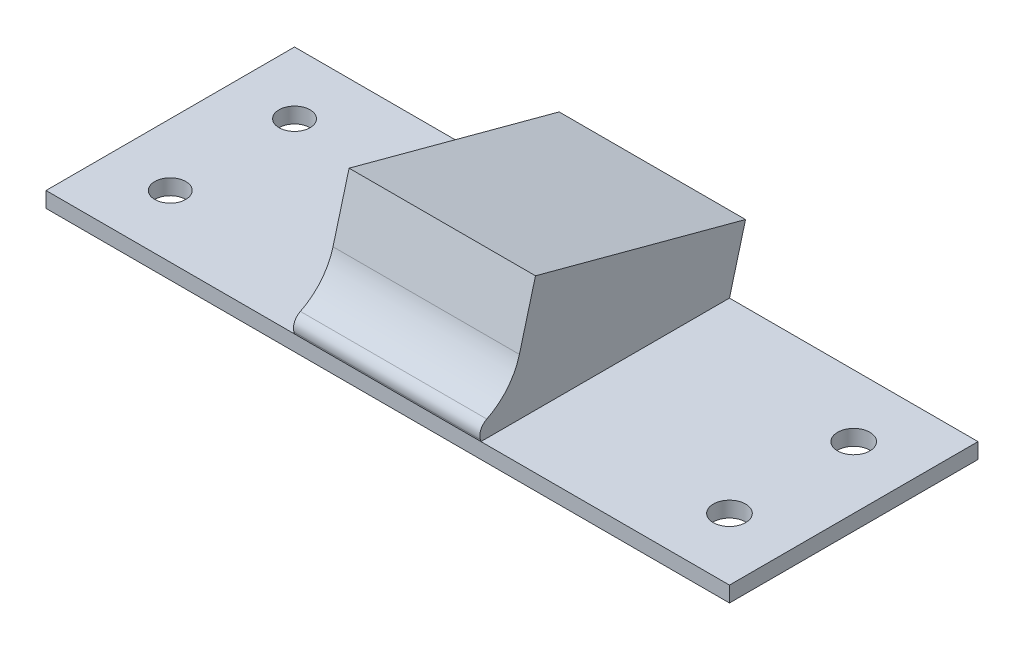
ISO-10303-21;
HEADER;
FILE_DESCRIPTION(('STEP AP214'),'2;1');
FILE_NAME('part.step','',(''),(''),'','','');
FILE_SCHEMA(('AUTOMOTIVE_DESIGN { 1 0 10303 214 1 1 1 1 }'));
ENDSEC;
DATA;
#1=APPLICATION_CONTEXT('core data for automotive mechanical design processes');
#2=APPLICATION_PROTOCOL_DEFINITION('international standard','automotive_design',2000,#1);
#3=PRODUCT_CONTEXT('',#1,'mechanical');
#4=PRODUCT('Part','Part','',(#3));
#5=PRODUCT_RELATED_PRODUCT_CATEGORY('part','',(#4));
#6=PRODUCT_DEFINITION_FORMATION('','',#4);
#7=PRODUCT_DEFINITION_CONTEXT('part definition',#1,'design');
#8=PRODUCT_DEFINITION('design','',#6,#7);
#9=PRODUCT_DEFINITION_SHAPE('','',#8);
#10=(LENGTH_UNIT() NAMED_UNIT(*) SI_UNIT(.MILLI.,.METRE.));
#11=(NAMED_UNIT(*) PLANE_ANGLE_UNIT() SI_UNIT($,.RADIAN.));
#12=(NAMED_UNIT(*) SI_UNIT($,.STERADIAN.) SOLID_ANGLE_UNIT());
#13=UNCERTAINTY_MEASURE_WITH_UNIT(LENGTH_MEASURE(1.E-05),#10,'distance_accuracy_value','');
#14=(GEOMETRIC_REPRESENTATION_CONTEXT(3) GLOBAL_UNCERTAINTY_ASSIGNED_CONTEXT((#13)) GLOBAL_UNIT_ASSIGNED_CONTEXT((#10,
#11,#12)) REPRESENTATION_CONTEXT('',''));
#15=CARTESIAN_POINT('',(0.,0.,0.));
#16=DIRECTION('',(0.,0.,1.));
#17=DIRECTION('',(1.,0.,0.));
#18=AXIS2_PLACEMENT_3D('',#15,#16,#17);
#19=CARTESIAN_POINT('',(88.9,-7.39575421380455,23.1986695137899));
#20=DIRECTION('',(0.,0.28527897121386,-0.958444525563771));
#21=DIRECTION('',(0.,0.958444525563771,0.28527897121386));
#22=AXIS2_PLACEMENT_3D('',#19,#20,#21);
#23=PLANE('',#22);
#24=DIRECTION('',(0.,-0.958444525563771,-0.28527897121386));
#25=VECTOR('',#24,1.);
#26=CARTESIAN_POINT('',(63.5,7.39575421380454,27.6013304862101));
#27=LINE('',#26,#25);
#28=CARTESIAN_POINT('',(63.5,-7.00664085970769,23.31448827469));
#29=VERTEX_POINT('',#28);
#30=CARTESIAN_POINT('',(63.5,-7.39575421380454,23.1986695137899));
#31=VERTEX_POINT('',#30);
#32=EDGE_CURVE('E175',#29,#31,#27,.T.);
#33=ORIENTED_EDGE('',*,*,#32,.F.);
#34=DIRECTION('',(1.,0.,0.));
#35=VECTOR('',#34,1.);
#36=CARTESIAN_POINT('',(88.9,-7.00664085970769,23.31448827469));
#37=LINE('',#36,#35);
#38=CARTESIAN_POINT('',(25.4,-7.00664085970769,23.31448827469));
#39=VERTEX_POINT('',#38);
#40=EDGE_CURVE('E60',#29,#39,#37,.F.);
#41=ORIENTED_EDGE('',*,*,#40,.T.);
#42=DIRECTION('',(0.,0.958444525563771,0.28527897121386));
#43=VECTOR('',#42,1.);
#44=CARTESIAN_POINT('',(25.4,-7.39575421380455,23.1986695137899));
#45=LINE('',#44,#43);
#46=CARTESIAN_POINT('',(25.4,-7.39575421380455,23.1986695137899));
#47=VERTEX_POINT('',#46);
#48=EDGE_CURVE('E173',#47,#39,#45,.T.);
#49=ORIENTED_EDGE('',*,*,#48,.F.);
#50=DIRECTION('',(-1.,0.,0.));
#51=VECTOR('',#50,1.);
#52=CARTESIAN_POINT('',(88.9,-7.39575421380455,23.1986695137899));
#53=LINE('',#52,#51);
#54=EDGE_CURVE('E237',#31,#47,#53,.T.);
#55=ORIENTED_EDGE('',*,*,#54,.F.);
#56=EDGE_LOOP('',(#33,#41,#49,#55));
#57=FACE_BOUND('',#56,.T.);
#58=ADVANCED_FACE('F37',(#57),#23,.F.);
#59=CARTESIAN_POINT('',(88.9,-10.5707542138046,23.1986695137899));
#60=DIRECTION('',(0.,0.,-1.));
#61=DIRECTION('',(0.,1.,0.));
#62=AXIS2_PLACEMENT_3D('',#59,#60,#61);
#63=PLANE('',#62);
#64=CARTESIAN_POINT('',(114.3,-7.39575421380454,23.1986695137899));
#65=VERTEX_POINT('',#64);
#66=EDGE_CURVE('E238',#65,#31,#53,.T.);
#67=ORIENTED_EDGE('',*,*,#66,.T.);
#68=ORIENTED_EDGE('',*,*,#54,.T.);
#69=DIRECTION('',(1.,0.,0.));
#70=VECTOR('',#69,1.);
#71=CARTESIAN_POINT('',(-25.4,-7.39575421380455,23.1986695137899));
#72=LINE('',#71,#70);
#73=CARTESIAN_POINT('',(-25.4,-7.39575421380455,23.1986695137899));
#74=VERTEX_POINT('',#73);
#75=EDGE_CURVE('E228',#74,#47,#72,.T.);
#76=ORIENTED_EDGE('',*,*,#75,.F.);
#77=DIRECTION('',(0.,1.,0.));
#78=VECTOR('',#77,1.);
#79=CARTESIAN_POINT('',(-25.4,-10.5707542138045,23.1986695137899));
#80=LINE('',#79,#78);
#81=CARTESIAN_POINT('',(-25.4,-10.5707542138045,23.1986695137899));
#82=VERTEX_POINT('',#81);
#83=EDGE_CURVE('E222',#82,#74,#80,.T.);
#84=ORIENTED_EDGE('',*,*,#83,.F.);
#85=DIRECTION('',(-1.,0.,0.));
#86=VECTOR('',#85,1.);
#87=CARTESIAN_POINT('',(88.9,-10.5707542138046,23.1986695137899));
#88=LINE('',#87,#86);
#89=CARTESIAN_POINT('',(114.3,-10.5707542138046,23.1986695137899));
#90=VERTEX_POINT('',#89);
#91=EDGE_CURVE('E230',#90,#82,#88,.T.);
#92=ORIENTED_EDGE('',*,*,#91,.F.);
#93=DIRECTION('',(0.,-1.,0.));
#94=VECTOR('',#93,1.);
#95=CARTESIAN_POINT('',(114.3,-10.5707542138046,23.1986695137899));
#96=LINE('',#95,#94);
#97=EDGE_CURVE('E196',#65,#90,#96,.T.);
#98=ORIENTED_EDGE('',*,*,#97,.F.);
#99=EDGE_LOOP('',(#67,#68,#76,#84,#92,#98));
#100=FACE_BOUND('',#99,.T.);
#101=ADVANCED_FACE('F284',(#100),#63,.F.);
#102=CARTESIAN_POINT('',(0.,-10.5707542138045,-27.6013304862101));
#103=DIRECTION('',(0.,0.,1.));
#104=DIRECTION('',(0.,-1.,0.));
#105=AXIS2_PLACEMENT_3D('',#102,#103,#104);
#106=PLANE('',#105);
#107=DIRECTION('',(1.,0.,0.));
#108=VECTOR('',#107,1.);
#109=CARTESIAN_POINT('',(-25.4,-7.39575421380455,-27.6013304862101));
#110=LINE('',#109,#108);
#111=CARTESIAN_POINT('',(-25.4,-7.39575421380455,-27.6013304862101));
#112=VERTEX_POINT('',#111);
#113=CARTESIAN_POINT('',(25.4,-7.39575421380455,-27.6013304862101));
#114=VERTEX_POINT('',#113);
#115=EDGE_CURVE('E226',#112,#114,#110,.T.);
#116=ORIENTED_EDGE('',*,*,#115,.T.);
#117=DIRECTION('',(0.,-1.,0.));
#118=VECTOR('',#117,1.);
#119=CARTESIAN_POINT('',(25.4,0.,-27.6013304862101));
#120=LINE('',#119,#118);
#121=CARTESIAN_POINT('',(25.4,-7.73015155767654,-27.6013304862101));
#122=VERTEX_POINT('',#121);
#123=EDGE_CURVE('E52',#114,#122,#120,.T.);
#124=ORIENTED_EDGE('',*,*,#123,.T.);
#125=DIRECTION('',(-1.,0.,0.));
#126=VECTOR('',#125,1.);
#127=CARTESIAN_POINT('',(63.5,-7.73015155767653,-27.6013304862101));
#128=LINE('',#127,#126);
#129=CARTESIAN_POINT('',(63.5,-7.73015155767653,-27.6013304862101));
#130=VERTEX_POINT('',#129);
#131=EDGE_CURVE('E244',#122,#130,#128,.F.);
#132=ORIENTED_EDGE('',*,*,#131,.T.);
#133=DIRECTION('',(0.,1.,0.));
#134=VECTOR('',#133,1.);
#135=CARTESIAN_POINT('',(63.5,-10.5707542138045,-27.6013304862101));
#136=LINE('',#135,#134);
#137=CARTESIAN_POINT('',(63.5,-7.39575421380454,-27.6013304862101));
#138=VERTEX_POINT('',#137);
#139=EDGE_CURVE('E242',#130,#138,#136,.T.);
#140=ORIENTED_EDGE('',*,*,#139,.T.);
#141=DIRECTION('',(-1.,0.,0.));
#142=VECTOR('',#141,1.);
#143=CARTESIAN_POINT('',(88.9,-7.39575421380454,-27.6013304862101));
#144=LINE('',#143,#142);
#145=CARTESIAN_POINT('',(114.3,-7.39575421380454,-27.6013304862101));
#146=VERTEX_POINT('',#145);
#147=EDGE_CURVE('E234',#146,#138,#144,.T.);
#148=ORIENTED_EDGE('',*,*,#147,.F.);
#149=DIRECTION('',(0.,1.,0.));
#150=VECTOR('',#149,1.);
#151=CARTESIAN_POINT('',(114.3,-10.5707542138046,-27.6013304862101));
#152=LINE('',#151,#150);
#153=CARTESIAN_POINT('',(114.3,-10.5707542138046,-27.6013304862101));
#154=VERTEX_POINT('',#153);
#155=EDGE_CURVE('E210',#154,#146,#152,.T.);
#156=ORIENTED_EDGE('',*,*,#155,.F.);
#157=DIRECTION('',(1.,0.,0.));
#158=VECTOR('',#157,1.);
#159=CARTESIAN_POINT('',(0.,-10.5707542138045,-27.6013304862101));
#160=LINE('',#159,#158);
#161=CARTESIAN_POINT('',(-25.4,-10.5707542138045,-27.6013304862101));
#162=VERTEX_POINT('',#161);
#163=EDGE_CURVE('E232',#162,#154,#160,.T.);
#164=ORIENTED_EDGE('',*,*,#163,.F.);
#165=DIRECTION('',(0.,-1.,0.));
#166=VECTOR('',#165,1.);
#167=CARTESIAN_POINT('',(-25.4,-10.5707542138045,-27.6013304862101));
#168=LINE('',#167,#166);
#169=EDGE_CURVE('E216',#112,#162,#168,.T.);
#170=ORIENTED_EDGE('',*,*,#169,.F.);
#171=EDGE_LOOP('',(#116,#124,#132,#140,#148,#156,#164,#170));
#172=FACE_BOUND('',#171,.T.);
#173=ADVANCED_FACE('F258',(#172),#106,.F.);
#174=CARTESIAN_POINT('',(0.,-10.5707542138045,0.));
#175=DIRECTION('',(0.,-1.,0.));
#176=DIRECTION('',(0.,0.,-1.));
#177=AXIS2_PLACEMENT_3D('',#174,#175,#176);
#178=PLANE('',#177);
#179=CARTESIAN_POINT('',(-12.7,-10.5707542138046,-14.9013304862101));
#180=DIRECTION('',(0.,1.,0.));
#181=DIRECTION('',(0.,0.,1.));
#182=AXIS2_PLACEMENT_3D('',#179,#180,#181);
#183=CIRCLE('',#182,3.175);
#184=CARTESIAN_POINT('',(-12.7,-10.5707542138046,-11.7263304862101));
#185=VERTEX_POINT('',#184);
#186=EDGE_CURVE('E181',#185,#185,#183,.T.);
#187=ORIENTED_EDGE('',*,*,#186,.T.);
#188=EDGE_LOOP('',(#187));
#189=FACE_BOUND('',#188,.T.);
#190=CARTESIAN_POINT('',(-12.7,-10.5707542138046,10.4986695137899));
#191=DIRECTION('',(0.,1.,0.));
#192=DIRECTION('',(0.,0.,-1.));
#193=AXIS2_PLACEMENT_3D('',#190,#191,#192);
#194=CIRCLE('',#193,3.175);
#195=CARTESIAN_POINT('',(-12.7,-10.5707542138046,7.32366951378987));
#196=VERTEX_POINT('',#195);
#197=EDGE_CURVE('E180',#196,#196,#194,.T.);
#198=ORIENTED_EDGE('',*,*,#197,.T.);
#199=EDGE_LOOP('',(#198));
#200=FACE_BOUND('',#199,.T.);
#201=CARTESIAN_POINT('',(101.6,-10.5707542138046,-14.9013304862101));
#202=DIRECTION('',(0.,1.,0.));
#203=DIRECTION('',(0.,0.,1.));
#204=AXIS2_PLACEMENT_3D('',#201,#202,#203);
#205=CIRCLE('',#204,3.302);
#206=CARTESIAN_POINT('',(101.6,-10.5707542138046,-11.5993304862101));
#207=VERTEX_POINT('',#206);
#208=EDGE_CURVE('E193',#207,#207,#205,.T.);
#209=ORIENTED_EDGE('',*,*,#208,.T.);
#210=EDGE_LOOP('',(#209));
#211=FACE_BOUND('',#210,.T.);
#212=CARTESIAN_POINT('',(101.6,-10.5707542138046,10.4986695137899));
#213=DIRECTION('',(0.,1.,0.));
#214=DIRECTION('',(0.,0.,-1.));
#215=AXIS2_PLACEMENT_3D('',#212,#213,#214);
#216=CIRCLE('',#215,3.302);
#217=CARTESIAN_POINT('',(101.6,-10.5707542138046,7.19666951378988));
#218=VERTEX_POINT('',#217);
#219=EDGE_CURVE('E184',#218,#218,#216,.T.);
#220=ORIENTED_EDGE('',*,*,#219,.T.);
#221=EDGE_LOOP('',(#220));
#222=FACE_BOUND('',#221,.T.);
#223=ORIENTED_EDGE('',*,*,#91,.T.);
#224=DIRECTION('',(0.,0.,1.));
#225=VECTOR('',#224,1.);
#226=CARTESIAN_POINT('',(-25.4,-10.5707542138045,-27.6013304862101));
#227=LINE('',#226,#225);
#228=EDGE_CURVE('E219',#162,#82,#227,.T.);
#229=ORIENTED_EDGE('',*,*,#228,.F.);
#230=ORIENTED_EDGE('',*,*,#163,.T.);
#231=DIRECTION('',(0.,0.,-1.));
#232=VECTOR('',#231,1.);
#233=CARTESIAN_POINT('',(114.3,-10.5707542138046,23.1986695137899));
#234=LINE('',#233,#232);
#235=EDGE_CURVE('E207',#90,#154,#234,.T.);
#236=ORIENTED_EDGE('',*,*,#235,.F.);
#237=EDGE_LOOP('',(#223,#229,#230,#236));
#238=FACE_BOUND('',#237,.T.);
#239=ADVANCED_FACE('F298',(#189,#200,#211,#222,#238),#178,.T.);
#240=CARTESIAN_POINT('',(-25.4,-7.39575421380455,-27.6013304862101));
#241=DIRECTION('',(0.,-1.,0.));
#242=DIRECTION('',(0.,0.,-1.));
#243=AXIS2_PLACEMENT_3D('',#240,#241,#242);
#244=PLANE('',#243);
#245=CARTESIAN_POINT('',(-12.7,-7.39575421380455,-14.9013304862101));
#246=DIRECTION('',(0.,1.,0.));
#247=DIRECTION('',(0.,0.,1.));
#248=AXIS2_PLACEMENT_3D('',#245,#246,#247);
#249=CIRCLE('',#248,3.175);
#250=CARTESIAN_POINT('',(-12.7,-7.39575421380455,-11.7263304862101));
#251=VERTEX_POINT('',#250);
#252=EDGE_CURVE('E185',#251,#251,#249,.T.);
#253=ORIENTED_EDGE('',*,*,#252,.F.);
#254=EDGE_LOOP('',(#253));
#255=FACE_BOUND('',#254,.T.);
#256=CARTESIAN_POINT('',(-12.7,-7.39575421380455,10.4986695137899));
#257=DIRECTION('',(0.,1.,0.));
#258=DIRECTION('',(0.,0.,-1.));
#259=AXIS2_PLACEMENT_3D('',#256,#257,#258);
#260=CIRCLE('',#259,3.175);
#261=CARTESIAN_POINT('',(-12.7,-7.39575421380455,7.32366951378987));
#262=VERTEX_POINT('',#261);
#263=EDGE_CURVE('E188',#262,#262,#260,.T.);
#264=ORIENTED_EDGE('',*,*,#263,.F.);
#265=EDGE_LOOP('',(#264));
#266=FACE_BOUND('',#265,.T.);
#267=ORIENTED_EDGE('',*,*,#75,.T.);
#268=DIRECTION('',(0.,0.,1.));
#269=VECTOR('',#268,1.);
#270=CARTESIAN_POINT('',(25.4,-7.39575421380455,-27.6013304862101));
#271=LINE('',#270,#269);
#272=EDGE_CURVE('E171',#114,#47,#271,.T.);
#273=ORIENTED_EDGE('',*,*,#272,.F.);
#274=ORIENTED_EDGE('',*,*,#115,.F.);
#275=DIRECTION('',(0.,0.,-1.));
#276=VECTOR('',#275,1.);
#277=CARTESIAN_POINT('',(-25.4,-7.39575421380455,-27.6013304862101));
#278=LINE('',#277,#276);
#279=EDGE_CURVE('E224',#74,#112,#278,.T.);
#280=ORIENTED_EDGE('',*,*,#279,.F.);
#281=EDGE_LOOP('',(#267,#273,#274,#280));
#282=FACE_BOUND('',#281,.T.);
#283=ADVANCED_FACE('F302',(#255,#266,#282),#244,.F.);
#284=CARTESIAN_POINT('',(-25.4,0.,0.));
#285=DIRECTION('',(1.,0.,0.));
#286=DIRECTION('',(0.,0.,-1.));
#287=AXIS2_PLACEMENT_3D('',#284,#285,#286);
#288=PLANE('',#287);
#289=ORIENTED_EDGE('',*,*,#169,.T.);
#290=ORIENTED_EDGE('',*,*,#228,.T.);
#291=ORIENTED_EDGE('',*,*,#83,.T.);
#292=ORIENTED_EDGE('',*,*,#279,.T.);
#293=EDGE_LOOP('',(#289,#290,#291,#292));
#294=FACE_BOUND('',#293,.T.);
#295=ADVANCED_FACE('F300',(#294),#288,.F.);
#296=CARTESIAN_POINT('',(114.3,-7.39575421380454,23.1986695137899));
#297=DIRECTION('',(0.,-1.,0.));
#298=DIRECTION('',(0.,0.,-1.));
#299=AXIS2_PLACEMENT_3D('',#296,#297,#298);
#300=PLANE('',#299);
#301=CARTESIAN_POINT('',(101.6,-7.39575421380454,-14.9013304862101));
#302=DIRECTION('',(0.,1.,0.));
#303=DIRECTION('',(0.,0.,1.));
#304=AXIS2_PLACEMENT_3D('',#301,#302,#303);
#305=CIRCLE('',#304,3.302);
#306=CARTESIAN_POINT('',(101.6,-7.39575421380454,-11.5993304862101));
#307=VERTEX_POINT('',#306);
#308=EDGE_CURVE('E197',#307,#307,#305,.T.);
#309=ORIENTED_EDGE('',*,*,#308,.F.);
#310=EDGE_LOOP('',(#309));
#311=FACE_BOUND('',#310,.T.);
#312=CARTESIAN_POINT('',(101.6,-7.39575421380454,10.4986695137899));
#313=DIRECTION('',(0.,1.,0.));
#314=DIRECTION('',(0.,0.,-1.));
#315=AXIS2_PLACEMENT_3D('',#312,#313,#314);
#316=CIRCLE('',#315,3.302);
#317=CARTESIAN_POINT('',(101.6,-7.39575421380454,7.19666951378988));
#318=VERTEX_POINT('',#317);
#319=EDGE_CURVE('E200',#318,#318,#316,.T.);
#320=ORIENTED_EDGE('',*,*,#319,.F.);
#321=EDGE_LOOP('',(#320));
#322=FACE_BOUND('',#321,.T.);
#323=DIRECTION('',(0.,0.,1.));
#324=VECTOR('',#323,1.);
#325=CARTESIAN_POINT('',(114.3,-7.39575421380454,23.1986695137899));
#326=LINE('',#325,#324);
#327=EDGE_CURVE('E213',#146,#65,#326,.T.);
#328=ORIENTED_EDGE('',*,*,#327,.F.);
#329=ORIENTED_EDGE('',*,*,#147,.T.);
#330=DIRECTION('',(0.,0.,-1.));
#331=VECTOR('',#330,1.);
#332=CARTESIAN_POINT('',(63.5,-7.39575421380454,23.1986695137899));
#333=LINE('',#332,#331);
#334=EDGE_CURVE('E177',#31,#138,#333,.T.);
#335=ORIENTED_EDGE('',*,*,#334,.F.);
#336=ORIENTED_EDGE('',*,*,#66,.F.);
#337=EDGE_LOOP('',(#328,#329,#335,#336));
#338=FACE_BOUND('',#337,.T.);
#339=ADVANCED_FACE('F291',(#311,#322,#338),#300,.F.);
#340=CARTESIAN_POINT('',(114.3,0.,0.));
#341=DIRECTION('',(-1.,0.,0.));
#342=DIRECTION('',(0.,0.,1.));
#343=AXIS2_PLACEMENT_3D('',#340,#341,#342);
#344=PLANE('',#343);
#345=ORIENTED_EDGE('',*,*,#97,.T.);
#346=ORIENTED_EDGE('',*,*,#235,.T.);
#347=ORIENTED_EDGE('',*,*,#155,.T.);
#348=ORIENTED_EDGE('',*,*,#327,.T.);
#349=EDGE_LOOP('',(#345,#346,#347,#348));
#350=FACE_BOUND('',#349,.T.);
#351=ADVANCED_FACE('F293',(#350),#344,.F.);
#352=CARTESIAN_POINT('',(101.6,-10.5707542138046,10.4986695137899));
#353=DIRECTION('',(0.,1.,0.));
#354=DIRECTION('',(0.,0.,1.));
#355=AXIS2_PLACEMENT_3D('',#352,#353,#354);
#356=CYLINDRICAL_SURFACE('',#355,3.302);
#357=ORIENTED_EDGE('',*,*,#219,.F.);
#358=EDGE_LOOP('',(#357));
#359=FACE_BOUND('',#358,.T.);
#360=ORIENTED_EDGE('',*,*,#319,.T.);
#361=EDGE_LOOP('',(#360));
#362=FACE_BOUND('',#361,.T.);
#363=ADVANCED_FACE('F352',(#359,#362),#356,.F.);
#364=CARTESIAN_POINT('',(101.6,-10.5707542138046,-14.9013304862101));
#365=DIRECTION('',(0.,1.,0.));
#366=DIRECTION('',(0.,0.,1.));
#367=AXIS2_PLACEMENT_3D('',#364,#365,#366);
#368=CYLINDRICAL_SURFACE('',#367,3.302);
#369=ORIENTED_EDGE('',*,*,#208,.F.);
#370=EDGE_LOOP('',(#369));
#371=FACE_BOUND('',#370,.T.);
#372=ORIENTED_EDGE('',*,*,#308,.T.);
#373=EDGE_LOOP('',(#372));
#374=FACE_BOUND('',#373,.T.);
#375=ADVANCED_FACE('F348',(#371,#374),#368,.F.);
#376=CARTESIAN_POINT('',(-12.7,-10.5707542138046,10.4986695137899));
#377=DIRECTION('',(0.,1.,0.));
#378=DIRECTION('',(0.,0.,1.));
#379=AXIS2_PLACEMENT_3D('',#376,#377,#378);
#380=CYLINDRICAL_SURFACE('',#379,3.175);
#381=ORIENTED_EDGE('',*,*,#197,.F.);
#382=EDGE_LOOP('',(#381));
#383=FACE_BOUND('',#382,.T.);
#384=ORIENTED_EDGE('',*,*,#263,.T.);
#385=EDGE_LOOP('',(#384));
#386=FACE_BOUND('',#385,.T.);
#387=ADVANCED_FACE('F344',(#383,#386),#380,.F.);
#388=CARTESIAN_POINT('',(-12.7,-10.5707542138046,-14.9013304862101));
#389=DIRECTION('',(0.,1.,0.));
#390=DIRECTION('',(0.,0.,1.));
#391=AXIS2_PLACEMENT_3D('',#388,#389,#390);
#392=CYLINDRICAL_SURFACE('',#391,3.175);
#393=ORIENTED_EDGE('',*,*,#186,.F.);
#394=EDGE_LOOP('',(#393));
#395=FACE_BOUND('',#394,.T.);
#396=ORIENTED_EDGE('',*,*,#252,.T.);
#397=EDGE_LOOP('',(#396));
#398=FACE_BOUND('',#397,.T.);
#399=ADVANCED_FACE('F341',(#395,#398),#392,.F.);
#400=CARTESIAN_POINT('',(63.5,0.,0.));
#401=DIRECTION('',(1.,0.,0.));
#402=DIRECTION('',(0.,0.,-1.));
#403=AXIS2_PLACEMENT_3D('',#400,#401,#402);
#404=PLANE('',#403);
#405=CARTESIAN_POINT('',(63.5,7.39575421380454,27.6013304862101));
#406=DIRECTION('',(1.,0.,0.));
#407=DIRECTION('',(0.,0.,1.));
#408=AXIS2_PLACEMENT_3D('',#405,#406,#407);
#409=CIRCLE('',#408,12.7);
#410=CARTESIAN_POINT('',(63.5,-4.00240119171965,22.0002543975001));
#411=VERTEX_POINT('',#410);
#412=CARTESIAN_POINT('',(63.5,4.10875234100252,15.334072492339));
#413=VERTEX_POINT('',#412);
#414=EDGE_CURVE('E161',#411,#413,#409,.T.);
#415=ORIENTED_EDGE('',*,*,#414,.F.);
#416=CARTESIAN_POINT('',(63.5,-6.28203227282449,20.880039179758));
#417=DIRECTION('',(1.,0.,0.));
#418=DIRECTION('',(0.,0.,-1.));
#419=AXIS2_PLACEMENT_3D('',#416,#417,#418);
#420=CIRCLE('',#419,2.54);
#421=EDGE_CURVE('E251',#411,#29,#420,.T.);
#422=ORIENTED_EDGE('',*,*,#421,.T.);
#423=ORIENTED_EDGE('',*,*,#32,.T.);
#424=ORIENTED_EDGE('',*,*,#334,.T.);
#425=ORIENTED_EDGE('',*,*,#139,.F.);
#426=CARTESIAN_POINT('',(63.5,-7.73015155767653,-30.1413304862101));
#427=DIRECTION('',(1.,0.,0.));
#428=DIRECTION('',(0.,0.,-1.));
#429=AXIS2_PLACEMENT_3D('',#426,#427,#428);
#430=CIRCLE('',#429,2.54);
#431=CARTESIAN_POINT('',(63.5,-7.07275118311612,-27.6878788874359));
#432=VERTEX_POINT('',#431);
#433=EDGE_CURVE('E11',#130,#432,#430,.F.);
#434=ORIENTED_EDGE('',*,*,#433,.T.);
#435=DIRECTION('',(0.,-0.965925826289068,0.258819045102521));
#436=VECTOR('',#435,1.);
#437=CARTESIAN_POINT('',(63.5,4.87150378006662,-30.8883323590121));
#438=LINE('',#437,#436);
#439=CARTESIAN_POINT('',(63.5,4.87150378006662,-30.8883323590121));
#440=VERTEX_POINT('',#439);
#441=EDGE_CURVE('E267',#440,#432,#438,.T.);
#442=ORIENTED_EDGE('',*,*,#441,.F.);
#443=DIRECTION('',(0.,-0.258819045102521,-0.965925826289068));
#444=VECTOR('',#443,1.);
#445=CARTESIAN_POINT('',(63.5,16.3760103348737,12.0470706195369));
#446=LINE('',#445,#444);
#447=CARTESIAN_POINT('',(63.5,16.3760103348737,12.0470706195369));
#448=VERTEX_POINT('',#447);
#449=EDGE_CURVE('E149',#448,#440,#446,.T.);
#450=ORIENTED_EDGE('',*,*,#449,.F.);
#451=DIRECTION('',(0.,-0.965925826289068,0.258819045102521));
#452=VECTOR('',#451,1.);
#453=CARTESIAN_POINT('',(63.5,16.3760103348737,12.0470706195369));
#454=LINE('',#453,#452);
#455=EDGE_CURVE('E163',#448,#413,#454,.T.);
#456=ORIENTED_EDGE('',*,*,#455,.T.);
#457=EDGE_LOOP('',(#415,#422,#423,#424,#425,#434,#442,#450,#456));
#458=FACE_BOUND('',#457,.T.);
#459=ADVANCED_FACE('F266',(#458),#404,.T.);
#460=CARTESIAN_POINT('',(25.4,0.,0.));
#461=DIRECTION('',(1.,0.,0.));
#462=DIRECTION('',(0.,0.,-1.));
#463=AXIS2_PLACEMENT_3D('',#460,#461,#462);
#464=PLANE('',#463);
#465=ORIENTED_EDGE('',*,*,#48,.T.);
#466=CARTESIAN_POINT('',(25.4,-6.28203227282449,20.880039179758));
#467=DIRECTION('',(1.,0.,0.));
#468=DIRECTION('',(0.,0.,-1.));
#469=AXIS2_PLACEMENT_3D('',#466,#467,#468);
#470=CIRCLE('',#469,2.54);
#471=CARTESIAN_POINT('',(25.4,-4.00240119171965,22.0002543975001));
#472=VERTEX_POINT('',#471);
#473=EDGE_CURVE('E254',#39,#472,#470,.F.);
#474=ORIENTED_EDGE('',*,*,#473,.T.);
#475=CARTESIAN_POINT('',(25.4,7.39575421380454,27.6013304862101));
#476=DIRECTION('',(1.,0.,0.));
#477=DIRECTION('',(0.,0.,-1.));
#478=AXIS2_PLACEMENT_3D('',#475,#476,#477);
#479=CIRCLE('',#478,12.7);
#480=CARTESIAN_POINT('',(25.4,4.10875234100252,15.334072492339));
#481=VERTEX_POINT('',#480);
#482=EDGE_CURVE('E158',#481,#472,#479,.F.);
#483=ORIENTED_EDGE('',*,*,#482,.F.);
#484=DIRECTION('',(0.,-0.965925826289068,0.258819045102521));
#485=VECTOR('',#484,1.);
#486=CARTESIAN_POINT('',(25.4,16.3760103348737,12.0470706195369));
#487=LINE('',#486,#485);
#488=CARTESIAN_POINT('',(25.4,16.3760103348737,12.0470706195369));
#489=VERTEX_POINT('',#488);
#490=EDGE_CURVE('E140',#489,#481,#487,.T.);
#491=ORIENTED_EDGE('',*,*,#490,.F.);
#492=DIRECTION('',(0.,0.258819045102521,0.965925826289068));
#493=VECTOR('',#492,1.);
#494=CARTESIAN_POINT('',(25.4,4.87150378006662,-30.8883323590121));
#495=LINE('',#494,#493);
#496=CARTESIAN_POINT('',(25.4,4.87150378006662,-30.8883323590121));
#497=VERTEX_POINT('',#496);
#498=EDGE_CURVE('E133',#497,#489,#495,.T.);
#499=ORIENTED_EDGE('',*,*,#498,.F.);
#500=DIRECTION('',(0.,-0.965925826289068,0.258819045102521));
#501=VECTOR('',#500,1.);
#502=CARTESIAN_POINT('',(25.4,4.87150378006662,-30.8883323590121));
#503=LINE('',#502,#501);
#504=CARTESIAN_POINT('',(25.4,-7.07275118311614,-27.6878788874359));
#505=VERTEX_POINT('',#504);
#506=EDGE_CURVE('E137',#497,#505,#503,.T.);
#507=ORIENTED_EDGE('',*,*,#506,.T.);
#508=CARTESIAN_POINT('',(25.4,-7.73015155767654,-30.1413304862101));
#509=DIRECTION('',(1.,0.,0.));
#510=DIRECTION('',(0.,0.,-1.));
#511=AXIS2_PLACEMENT_3D('',#508,#509,#510);
#512=CIRCLE('',#511,2.54);
#513=EDGE_CURVE('E45',#505,#122,#512,.T.);
#514=ORIENTED_EDGE('',*,*,#513,.T.);
#515=ORIENTED_EDGE('',*,*,#123,.F.);
#516=ORIENTED_EDGE('',*,*,#272,.T.);
#517=EDGE_LOOP('',(#465,#474,#483,#491,#499,#507,#514,#515,#516));
#518=FACE_BOUND('',#517,.T.);
#519=ADVANCED_FACE('F135',(#518),#464,.F.);
#520=CARTESIAN_POINT('',(-25.401,7.39575421380454,27.6013304862101));
#521=DIRECTION('',(1.,0.,0.));
#522=DIRECTION('',(0.,0.,-1.));
#523=AXIS2_PLACEMENT_3D('',#520,#521,#522);
#524=CYLINDRICAL_SURFACE('',#523,12.7);
#525=ORIENTED_EDGE('',*,*,#482,.T.);
#526=DIRECTION('',(1.,0.,0.));
#527=VECTOR('',#526,1.);
#528=CARTESIAN_POINT('',(-25.401,-4.00240119171965,22.0002543975001));
#529=LINE('',#528,#527);
#530=EDGE_CURVE('E248',#472,#411,#529,.T.);
#531=ORIENTED_EDGE('',*,*,#530,.T.);
#532=ORIENTED_EDGE('',*,*,#414,.T.);
#533=DIRECTION('',(1.,0.,0.));
#534=VECTOR('',#533,1.);
#535=CARTESIAN_POINT('',(-25.401,4.10875234100253,15.334072492339));
#536=LINE('',#535,#534);
#537=EDGE_CURVE('E168',#481,#413,#536,.T.);
#538=ORIENTED_EDGE('',*,*,#537,.F.);
#539=EDGE_LOOP('',(#525,#531,#532,#538));
#540=FACE_BOUND('',#539,.T.);
#541=ADVANCED_FACE('F276',(#540),#524,.F.);
#542=CARTESIAN_POINT('',(63.5,4.87150378006662,-30.8883323590121));
#543=DIRECTION('',(0.,0.258819045102521,0.965925826289068));
#544=DIRECTION('',(0.,-0.965925826289068,0.258819045102521));
#545=AXIS2_PLACEMENT_3D('',#542,#543,#544);
#546=PLANE('',#545);
#547=ORIENTED_EDGE('',*,*,#441,.T.);
#548=DIRECTION('',(-1.,0.,0.));
#549=VECTOR('',#548,1.);
#550=CARTESIAN_POINT('',(25.4,-7.07275118311614,-27.6878788874359));
#551=LINE('',#550,#549);
#552=EDGE_CURVE('E157',#432,#505,#551,.T.);
#553=ORIENTED_EDGE('',*,*,#552,.T.);
#554=ORIENTED_EDGE('',*,*,#506,.F.);
#555=DIRECTION('',(-1.,0.,0.));
#556=VECTOR('',#555,1.);
#557=CARTESIAN_POINT('',(63.5,4.87150378006662,-30.8883323590121));
#558=LINE('',#557,#556);
#559=EDGE_CURVE('E144',#440,#497,#558,.T.);
#560=ORIENTED_EDGE('',*,*,#559,.F.);
#561=EDGE_LOOP('',(#547,#553,#554,#560));
#562=FACE_BOUND('',#561,.T.);
#563=ADVANCED_FACE('F155',(#562),#546,.F.);
#564=CARTESIAN_POINT('',(25.4,16.3760103348737,12.0470706195369));
#565=DIRECTION('',(0.,-0.258819045102521,-0.965925826289068));
#566=DIRECTION('',(0.,0.965925826289068,-0.258819045102521));
#567=AXIS2_PLACEMENT_3D('',#564,#565,#566);
#568=PLANE('',#567);
#569=ORIENTED_EDGE('',*,*,#537,.T.);
#570=ORIENTED_EDGE('',*,*,#455,.F.);
#571=DIRECTION('',(1.,0.,0.));
#572=VECTOR('',#571,1.);
#573=CARTESIAN_POINT('',(25.4,16.3760103348737,12.0470706195369));
#574=LINE('',#573,#572);
#575=EDGE_CURVE('E143',#489,#448,#574,.T.);
#576=ORIENTED_EDGE('',*,*,#575,.F.);
#577=ORIENTED_EDGE('',*,*,#490,.T.);
#578=EDGE_LOOP('',(#569,#570,#576,#577));
#579=FACE_BOUND('',#578,.T.);
#580=ADVANCED_FACE('F274',(#579),#568,.F.);
#581=CARTESIAN_POINT('',(0.,12.2672579938712,-3.28700187280202));
#582=DIRECTION('',(0.,0.965925826289068,-0.258819045102521));
#583=DIRECTION('',(0.,0.258819045102521,0.965925826289068));
#584=AXIS2_PLACEMENT_3D('',#581,#582,#583);
#585=PLANE('',#584);
#586=ORIENTED_EDGE('',*,*,#559,.T.);
#587=ORIENTED_EDGE('',*,*,#498,.T.);
#588=ORIENTED_EDGE('',*,*,#575,.T.);
#589=ORIENTED_EDGE('',*,*,#449,.T.);
#590=EDGE_LOOP('',(#586,#587,#588,#589));
#591=FACE_BOUND('',#590,.T.);
#592=ADVANCED_FACE('F147',(#591),#585,.T.);
#593=CARTESIAN_POINT('',(63.5,-7.73015155767653,-30.1413304862101));
#594=DIRECTION('',(1.,0.,0.));
#595=DIRECTION('',(0.,1.,0.));
#596=AXIS2_PLACEMENT_3D('',#593,#594,#595);
#597=CYLINDRICAL_SURFACE('',#596,2.54);
#598=ORIENTED_EDGE('',*,*,#433,.F.);
#599=ORIENTED_EDGE('',*,*,#131,.F.);
#600=ORIENTED_EDGE('',*,*,#513,.F.);
#601=ORIENTED_EDGE('',*,*,#552,.F.);
#602=EDGE_LOOP('',(#598,#599,#600,#601));
#603=FACE_BOUND('',#602,.T.);
#604=ADVANCED_FACE('F263',(#603),#597,.F.);
#605=CARTESIAN_POINT('',(-25.401,-6.28203227282449,20.880039179758));
#606=DIRECTION('',(1.,0.,0.));
#607=DIRECTION('',(0.,0.,-1.));
#608=AXIS2_PLACEMENT_3D('',#605,#606,#607);
#609=CYLINDRICAL_SURFACE('',#608,2.54);
#610=ORIENTED_EDGE('',*,*,#473,.F.);
#611=ORIENTED_EDGE('',*,*,#40,.F.);
#612=ORIENTED_EDGE('',*,*,#421,.F.);
#613=ORIENTED_EDGE('',*,*,#530,.F.);
#614=EDGE_LOOP('',(#610,#611,#612,#613));
#615=FACE_BOUND('',#614,.T.);
#616=ADVANCED_FACE('F39',(#615),#609,.T.);
#617=CLOSED_SHELL('',(#58,#101,#173,#239,#283,#295,#339,#351,#363,#375,#387,#399,#459,#519,#541,
#563,#580,#592,#604,#616));
#618=MANIFOLD_SOLID_BREP('B2',#617);
#619=ADVANCED_BREP_SHAPE_REPRESENTATION('',(#18,#618),#14);
#620=SHAPE_DEFINITION_REPRESENTATION(#9,#619);
ENDSEC;
END-ISO-10303-21;
